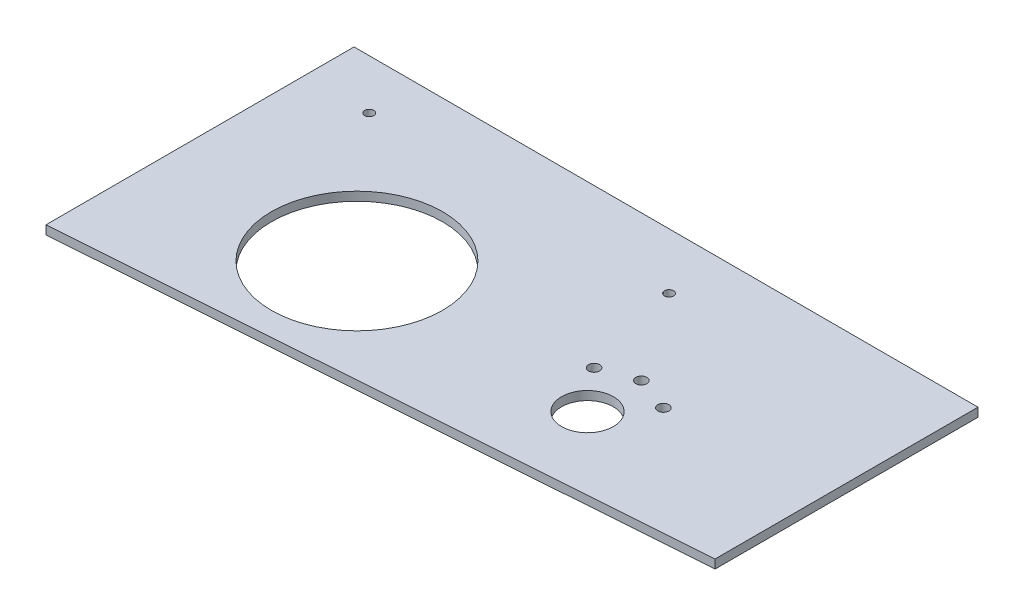
ISO-10303-21;
HEADER;
FILE_DESCRIPTION(('STEP AP214'),'2;1');
FILE_NAME('part.step','',(''),(''),'','','');
FILE_SCHEMA(('AUTOMOTIVE_DESIGN { 1 0 10303 214 1 1 1 1 }'));
ENDSEC;
DATA;
#1=APPLICATION_CONTEXT('core data for automotive mechanical design processes');
#2=APPLICATION_PROTOCOL_DEFINITION('international standard','automotive_design',2000,#1);
#3=PRODUCT_CONTEXT('',#1,'mechanical');
#4=PRODUCT('Part','Part','',(#3));
#5=PRODUCT_RELATED_PRODUCT_CATEGORY('part','',(#4));
#6=PRODUCT_DEFINITION_FORMATION('','',#4);
#7=PRODUCT_DEFINITION_CONTEXT('part definition',#1,'design');
#8=PRODUCT_DEFINITION('design','',#6,#7);
#9=PRODUCT_DEFINITION_SHAPE('','',#8);
#10=(LENGTH_UNIT() NAMED_UNIT(*) SI_UNIT(.MILLI.,.METRE.));
#11=(NAMED_UNIT(*) PLANE_ANGLE_UNIT() SI_UNIT($,.RADIAN.));
#12=(NAMED_UNIT(*) SI_UNIT($,.STERADIAN.) SOLID_ANGLE_UNIT());
#13=UNCERTAINTY_MEASURE_WITH_UNIT(LENGTH_MEASURE(1.E-05),#10,'distance_accuracy_value','');
#14=(GEOMETRIC_REPRESENTATION_CONTEXT(3) GLOBAL_UNCERTAINTY_ASSIGNED_CONTEXT((#13)) GLOBAL_UNIT_ASSIGNED_CONTEXT((#10,
#11,#12)) REPRESENTATION_CONTEXT('',''));
#15=CARTESIAN_POINT('',(0.,0.,0.));
#16=DIRECTION('',(0.,0.,1.));
#17=DIRECTION('',(1.,0.,0.));
#18=AXIS2_PLACEMENT_3D('',#15,#16,#17);
#19=CARTESIAN_POINT('',(-220.848796652154,6.35,-17.1230309984494));
#20=DIRECTION('',(0.,0.,1.));
#21=DIRECTION('',(1.,0.,0.));
#22=AXIS2_PLACEMENT_3D('',#19,#20,#21);
#23=PLANE('',#22);
#24=DIRECTION('',(-1.,0.,0.));
#25=VECTOR('',#24,1.);
#26=CARTESIAN_POINT('',(-220.848796652154,0.,-17.1230309984494));
#27=LINE('',#26,#25);
#28=CARTESIAN_POINT('',(-220.848796652154,0.,-17.1230309984494));
#29=VERTEX_POINT('',#28);
#30=CARTESIAN_POINT('',(-672.39173184106,0.,-17.1230309984494));
#31=VERTEX_POINT('',#30);
#32=EDGE_CURVE('E112',#29,#31,#27,.T.);
#33=ORIENTED_EDGE('',*,*,#32,.T.);
#34=DIRECTION('',(0.,-1.,0.));
#35=VECTOR('',#34,1.);
#36=CARTESIAN_POINT('',(-672.39173184106,6.35,-17.1230309984494));
#37=LINE('',#36,#35);
#38=CARTESIAN_POINT('',(-672.39173184106,6.35,-17.1230309984494));
#39=VERTEX_POINT('',#38);
#40=EDGE_CURVE('E12',#39,#31,#37,.T.);
#41=ORIENTED_EDGE('',*,*,#40,.F.);
#42=DIRECTION('',(-1.,0.,0.));
#43=VECTOR('',#42,1.);
#44=CARTESIAN_POINT('',(-220.848796652154,6.35,-17.1230309984494));
#45=LINE('',#44,#43);
#46=CARTESIAN_POINT('',(-220.848796652154,6.35,-17.1230309984494));
#47=VERTEX_POINT('',#46);
#48=EDGE_CURVE('E100',#47,#39,#45,.T.);
#49=ORIENTED_EDGE('',*,*,#48,.F.);
#50=DIRECTION('',(0.,-1.,0.));
#51=VECTOR('',#50,1.);
#52=CARTESIAN_POINT('',(-220.848796652154,6.35,-17.1230309984494));
#53=LINE('',#52,#51);
#54=EDGE_CURVE('E108',#47,#29,#53,.T.);
#55=ORIENTED_EDGE('',*,*,#54,.T.);
#56=EDGE_LOOP('',(#33,#41,#49,#55));
#57=FACE_BOUND('',#56,.T.);
#58=ADVANCED_FACE('F47',(#57),#23,.F.);
#59=CARTESIAN_POINT('',(-672.39173184106,6.35,-17.1230309984494));
#60=DIRECTION('',(1.,0.,0.));
#61=DIRECTION('',(0.,0.,-1.));
#62=AXIS2_PLACEMENT_3D('',#59,#60,#61);
#63=PLANE('',#62);
#64=DIRECTION('',(0.,0.,1.));
#65=VECTOR('',#64,1.);
#66=CARTESIAN_POINT('',(-672.39173184106,0.,-17.1230309984494));
#67=LINE('',#66,#65);
#68=CARTESIAN_POINT('',(-672.39173184106,0.,205.80854392186));
#69=VERTEX_POINT('',#68);
#70=EDGE_CURVE('E104',#31,#69,#67,.T.);
#71=ORIENTED_EDGE('',*,*,#70,.T.);
#72=DIRECTION('',(0.,-1.,0.));
#73=VECTOR('',#72,1.);
#74=CARTESIAN_POINT('',(-672.39173184106,6.35,205.80854392186));
#75=LINE('',#74,#73);
#76=CARTESIAN_POINT('',(-672.39173184106,6.35,205.80854392186));
#77=VERTEX_POINT('',#76);
#78=EDGE_CURVE('E55',#77,#69,#75,.T.);
#79=ORIENTED_EDGE('',*,*,#78,.F.);
#80=DIRECTION('',(0.,0.,1.));
#81=VECTOR('',#80,1.);
#82=CARTESIAN_POINT('',(-672.39173184106,6.35,-17.1230309984494));
#83=LINE('',#82,#81);
#84=EDGE_CURVE('E95',#39,#77,#83,.T.);
#85=ORIENTED_EDGE('',*,*,#84,.F.);
#86=ORIENTED_EDGE('',*,*,#40,.T.);
#87=EDGE_LOOP('',(#71,#79,#85,#86));
#88=FACE_BOUND('',#87,.T.);
#89=ADVANCED_FACE('F103',(#88),#63,.F.);
#90=CARTESIAN_POINT('',(-672.39173184106,6.35,205.80854392186));
#91=DIRECTION('',(-0.0721386043647769,0.,-0.997394616869523));
#92=DIRECTION('',(-0.997394616869523,0.,0.0721386043647769));
#93=AXIS2_PLACEMENT_3D('',#90,#91,#92);
#94=PLANE('',#93);
#95=DIRECTION('',(0.997394616869523,0.,-0.0721386043647769));
#96=VECTOR('',#95,1.);
#97=CARTESIAN_POINT('',(-672.39173184106,0.,205.80854392186));
#98=LINE('',#97,#96);
#99=CARTESIAN_POINT('',(-220.848796652154,0.,173.149778169203));
#100=VERTEX_POINT('',#99);
#101=EDGE_CURVE('E82',#69,#100,#98,.T.);
#102=ORIENTED_EDGE('',*,*,#101,.T.);
#103=DIRECTION('',(0.,-1.,0.));
#104=VECTOR('',#103,1.);
#105=CARTESIAN_POINT('',(-220.848796652154,6.35,173.149778169203));
#106=LINE('',#105,#104);
#107=CARTESIAN_POINT('',(-220.848796652154,6.35,173.149778169203));
#108=VERTEX_POINT('',#107);
#109=EDGE_CURVE('E105',#108,#100,#106,.T.);
#110=ORIENTED_EDGE('',*,*,#109,.F.);
#111=DIRECTION('',(0.997394616869523,0.,-0.0721386043647769));
#112=VECTOR('',#111,1.);
#113=CARTESIAN_POINT('',(-672.39173184106,6.35,205.80854392186));
#114=LINE('',#113,#112);
#115=EDGE_CURVE('E98',#77,#108,#114,.T.);
#116=ORIENTED_EDGE('',*,*,#115,.F.);
#117=ORIENTED_EDGE('',*,*,#78,.T.);
#118=EDGE_LOOP('',(#102,#110,#116,#117));
#119=FACE_BOUND('',#118,.T.);
#120=ADVANCED_FACE('F106',(#119),#94,.F.);
#121=CARTESIAN_POINT('',(-220.848796652154,6.35,173.149778169203));
#122=DIRECTION('',(-1.,0.,0.));
#123=DIRECTION('',(0.,0.,1.));
#124=AXIS2_PLACEMENT_3D('',#121,#122,#123);
#125=PLANE('',#124);
#126=DIRECTION('',(0.,0.,-1.));
#127=VECTOR('',#126,1.);
#128=CARTESIAN_POINT('',(-220.848796652154,0.,173.149778169203));
#129=LINE('',#128,#127);
#130=EDGE_CURVE('E88',#100,#29,#129,.T.);
#131=ORIENTED_EDGE('',*,*,#130,.T.);
#132=ORIENTED_EDGE('',*,*,#54,.F.);
#133=DIRECTION('',(0.,0.,-1.));
#134=VECTOR('',#133,1.);
#135=CARTESIAN_POINT('',(-220.848796652154,6.35,173.149778169203));
#136=LINE('',#135,#134);
#137=EDGE_CURVE('E63',#108,#47,#136,.T.);
#138=ORIENTED_EDGE('',*,*,#137,.F.);
#139=ORIENTED_EDGE('',*,*,#109,.T.);
#140=EDGE_LOOP('',(#131,#132,#138,#139));
#141=FACE_BOUND('',#140,.T.);
#142=ADVANCED_FACE('F121',(#141),#125,.F.);
#143=CARTESIAN_POINT('',(0.,6.35,0.));
#144=DIRECTION('',(0.,1.,0.));
#145=DIRECTION('',(0.,0.,1.));
#146=AXIS2_PLACEMENT_3D('',#143,#144,#145);
#147=PLANE('',#146);
#148=CARTESIAN_POINT('',(-359.363535158428,6.35,87.9976546238515));
#149=DIRECTION('',(0.,1.,0.));
#150=DIRECTION('',(0.,0.,1.));
#151=AXIS2_PLACEMENT_3D('',#148,#149,#150);
#152=CIRCLE('',#151,3.99999999999994);
#153=CARTESIAN_POINT('',(-359.363535158428,6.35,91.9976546238514));
#154=VERTEX_POINT('',#153);
#155=EDGE_CURVE('E145',#154,#154,#152,.T.);
#156=ORIENTED_EDGE('',*,*,#155,.F.);
#157=EDGE_LOOP('',(#156));
#158=FACE_BOUND('',#157,.T.);
#159=CARTESIAN_POINT('',(-625.491718044603,6.35,18.7958333678113));
#160=DIRECTION('',(0.,1.,0.));
#161=DIRECTION('',(0.,0.,1.));
#162=AXIS2_PLACEMENT_3D('',#159,#160,#161);
#163=CIRCLE('',#162,3.29999999999997);
#164=CARTESIAN_POINT('',(-625.491718044603,6.35,22.0958333678113));
#165=VERTEX_POINT('',#164);
#166=EDGE_CURVE('E152',#165,#165,#163,.T.);
#167=ORIENTED_EDGE('',*,*,#166,.F.);
#168=EDGE_LOOP('',(#167));
#169=FACE_BOUND('',#168,.T.);
#170=CARTESIAN_POINT('',(-403.939830291678,6.35,23.3318519883842));
#171=DIRECTION('',(0.,1.,0.));
#172=DIRECTION('',(0.,0.,1.));
#173=AXIS2_PLACEMENT_3D('',#170,#171,#172);
#174=CIRCLE('',#173,3.30000000000003);
#175=CARTESIAN_POINT('',(-403.939830291678,6.35,26.6318519883842));
#176=VERTEX_POINT('',#175);
#177=EDGE_CURVE('E133',#176,#176,#174,.T.);
#178=ORIENTED_EDGE('',*,*,#177,.F.);
#179=EDGE_LOOP('',(#178));
#180=FACE_BOUND('',#179,.T.);
#181=CARTESIAN_POINT('',(-359.363535158427,6.35,126.997654623851));
#182=DIRECTION('',(0.,1.,0.));
#183=DIRECTION('',(0.,0.,1.));
#184=AXIS2_PLACEMENT_3D('',#181,#182,#183);
#185=CIRCLE('',#184,18.7499999999999);
#186=CARTESIAN_POINT('',(-359.363535158427,6.35,145.747654623851));
#187=VERTEX_POINT('',#186);
#188=EDGE_CURVE('E140',#187,#187,#185,.T.);
#189=ORIENTED_EDGE('',*,*,#188,.F.);
#190=EDGE_LOOP('',(#189));
#191=FACE_BOUND('',#190,.T.);
#192=CARTESIAN_POINT('',(-384.432251936203,6.35,97.1219213422115));
#193=DIRECTION('',(0.,1.,0.));
#194=DIRECTION('',(0.,0.,1.));
#195=AXIS2_PLACEMENT_3D('',#192,#193,#194);
#196=CIRCLE('',#195,4.00000000000005);
#197=CARTESIAN_POINT('',(-384.432251936203,6.35,101.121921342212));
#198=VERTEX_POINT('',#197);
#199=EDGE_CURVE('E163',#198,#198,#196,.T.);
#200=ORIENTED_EDGE('',*,*,#199,.F.);
#201=EDGE_LOOP('',(#200));
#202=FACE_BOUND('',#201,.T.);
#203=CARTESIAN_POINT('',(-334.294818380653,6.35,97.121921342211));
#204=DIRECTION('',(0.,1.,0.));
#205=DIRECTION('',(0.,0.,1.));
#206=AXIS2_PLACEMENT_3D('',#203,#204,#205);
#207=CIRCLE('',#206,4.00000000000023);
#208=CARTESIAN_POINT('',(-334.294818380653,6.35,101.121921342211));
#209=VERTEX_POINT('',#208);
#210=EDGE_CURVE('E157',#209,#209,#207,.T.);
#211=ORIENTED_EDGE('',*,*,#210,.F.);
#212=EDGE_LOOP('',(#211));
#213=FACE_BOUND('',#212,.T.);
#214=CARTESIAN_POINT('',(-537.163535159258,6.35,115.999131995791));
#215=DIRECTION('',(0.,1.,0.));
#216=DIRECTION('',(0.,0.,1.));
#217=AXIS2_PLACEMENT_3D('',#214,#215,#216);
#218=CIRCLE('',#217,61.9124999999801);
#219=CARTESIAN_POINT('',(-537.163535159258,6.35,177.911631995771));
#220=VERTEX_POINT('',#219);
#221=EDGE_CURVE('E127',#220,#220,#218,.T.);
#222=ORIENTED_EDGE('',*,*,#221,.F.);
#223=EDGE_LOOP('',(#222));
#224=FACE_BOUND('',#223,.T.);
#225=ORIENTED_EDGE('',*,*,#48,.T.);
#226=ORIENTED_EDGE('',*,*,#84,.T.);
#227=ORIENTED_EDGE('',*,*,#115,.T.);
#228=ORIENTED_EDGE('',*,*,#137,.T.);
#229=EDGE_LOOP('',(#225,#226,#227,#228));
#230=FACE_BOUND('',#229,.T.);
#231=ADVANCED_FACE('F96',(#158,#169,#180,#191,#202,#213,#224,#230),#147,.T.);
#232=CARTESIAN_POINT('',(0.,0.,0.));
#233=DIRECTION('',(0.,1.,0.));
#234=DIRECTION('',(0.,0.,1.));
#235=AXIS2_PLACEMENT_3D('',#232,#233,#234);
#236=PLANE('',#235);
#237=CARTESIAN_POINT('',(-359.363535158428,0.,87.9976546238515));
#238=DIRECTION('',(0.,1.,0.));
#239=DIRECTION('',(0.,0.,1.));
#240=AXIS2_PLACEMENT_3D('',#237,#238,#239);
#241=CIRCLE('',#240,3.99999999999994);
#242=CARTESIAN_POINT('',(-359.363535158428,0.,91.9976546238514));
#243=VERTEX_POINT('',#242);
#244=EDGE_CURVE('E148',#243,#243,#241,.T.);
#245=ORIENTED_EDGE('',*,*,#244,.T.);
#246=EDGE_LOOP('',(#245));
#247=FACE_BOUND('',#246,.T.);
#248=CARTESIAN_POINT('',(-625.491718044603,0.,18.7958333678113));
#249=DIRECTION('',(0.,1.,0.));
#250=DIRECTION('',(0.,0.,1.));
#251=AXIS2_PLACEMENT_3D('',#248,#249,#250);
#252=CIRCLE('',#251,3.29999999999997);
#253=CARTESIAN_POINT('',(-625.491718044603,0.,22.0958333678113));
#254=VERTEX_POINT('',#253);
#255=EDGE_CURVE('E137',#254,#254,#252,.T.);
#256=ORIENTED_EDGE('',*,*,#255,.T.);
#257=EDGE_LOOP('',(#256));
#258=FACE_BOUND('',#257,.T.);
#259=CARTESIAN_POINT('',(-403.939830291678,0.,23.3318519883842));
#260=DIRECTION('',(0.,1.,0.));
#261=DIRECTION('',(0.,0.,1.));
#262=AXIS2_PLACEMENT_3D('',#259,#260,#261);
#263=CIRCLE('',#262,3.30000000000003);
#264=CARTESIAN_POINT('',(-403.939830291678,0.,26.6318519883842));
#265=VERTEX_POINT('',#264);
#266=EDGE_CURVE('E136',#265,#265,#263,.T.);
#267=ORIENTED_EDGE('',*,*,#266,.T.);
#268=EDGE_LOOP('',(#267));
#269=FACE_BOUND('',#268,.T.);
#270=CARTESIAN_POINT('',(-359.363535158427,0.,126.997654623851));
#271=DIRECTION('',(0.,1.,0.));
#272=DIRECTION('',(0.,0.,1.));
#273=AXIS2_PLACEMENT_3D('',#270,#271,#272);
#274=CIRCLE('',#273,18.7499999999999);
#275=CARTESIAN_POINT('',(-359.363535158427,0.,145.747654623851));
#276=VERTEX_POINT('',#275);
#277=EDGE_CURVE('E130',#276,#276,#274,.T.);
#278=ORIENTED_EDGE('',*,*,#277,.T.);
#279=EDGE_LOOP('',(#278));
#280=FACE_BOUND('',#279,.T.);
#281=CARTESIAN_POINT('',(-384.432251936203,0.,97.1219213422115));
#282=DIRECTION('',(0.,1.,0.));
#283=DIRECTION('',(0.,0.,1.));
#284=AXIS2_PLACEMENT_3D('',#281,#282,#283);
#285=CIRCLE('',#284,4.00000000000005);
#286=CARTESIAN_POINT('',(-384.432251936203,0.,101.121921342212));
#287=VERTEX_POINT('',#286);
#288=EDGE_CURVE('E149',#287,#287,#285,.T.);
#289=ORIENTED_EDGE('',*,*,#288,.T.);
#290=EDGE_LOOP('',(#289));
#291=FACE_BOUND('',#290,.T.);
#292=CARTESIAN_POINT('',(-334.294818380653,0.,97.121921342211));
#293=DIRECTION('',(0.,1.,0.));
#294=DIRECTION('',(0.,0.,1.));
#295=AXIS2_PLACEMENT_3D('',#292,#293,#294);
#296=CIRCLE('',#295,4.00000000000023);
#297=CARTESIAN_POINT('',(-334.294818380653,0.,101.121921342211));
#298=VERTEX_POINT('',#297);
#299=EDGE_CURVE('E160',#298,#298,#296,.T.);
#300=ORIENTED_EDGE('',*,*,#299,.T.);
#301=EDGE_LOOP('',(#300));
#302=FACE_BOUND('',#301,.T.);
#303=CARTESIAN_POINT('',(-537.163535159258,0.,115.999131995791));
#304=DIRECTION('',(0.,1.,0.));
#305=DIRECTION('',(0.,0.,1.));
#306=AXIS2_PLACEMENT_3D('',#303,#304,#305);
#307=CIRCLE('',#306,61.9124999999801);
#308=CARTESIAN_POINT('',(-537.163535159258,0.,177.911631995771));
#309=VERTEX_POINT('',#308);
#310=EDGE_CURVE('E115',#309,#309,#307,.T.);
#311=ORIENTED_EDGE('',*,*,#310,.T.);
#312=EDGE_LOOP('',(#311));
#313=FACE_BOUND('',#312,.T.);
#314=ORIENTED_EDGE('',*,*,#32,.F.);
#315=ORIENTED_EDGE('',*,*,#130,.F.);
#316=ORIENTED_EDGE('',*,*,#101,.F.);
#317=ORIENTED_EDGE('',*,*,#70,.F.);
#318=EDGE_LOOP('',(#314,#315,#316,#317));
#319=FACE_BOUND('',#318,.T.);
#320=ADVANCED_FACE('F124',(#247,#258,#269,#280,#291,#302,#313,#319),#236,.F.);
#321=CARTESIAN_POINT('',(-537.163535159258,0.,115.999131995791));
#322=DIRECTION('',(0.,1.,0.));
#323=DIRECTION('',(0.,0.,1.));
#324=AXIS2_PLACEMENT_3D('',#321,#322,#323);
#325=CYLINDRICAL_SURFACE('',#324,61.9124999999801);
#326=ORIENTED_EDGE('',*,*,#310,.F.);
#327=EDGE_LOOP('',(#326));
#328=FACE_BOUND('',#327,.T.);
#329=ORIENTED_EDGE('',*,*,#221,.T.);
#330=EDGE_LOOP('',(#329));
#331=FACE_BOUND('',#330,.T.);
#332=ADVANCED_FACE('F187',(#328,#331),#325,.F.);
#333=CARTESIAN_POINT('',(-334.294818380653,0.,97.121921342211));
#334=DIRECTION('',(0.,1.,0.));
#335=DIRECTION('',(0.,0.,1.));
#336=AXIS2_PLACEMENT_3D('',#333,#334,#335);
#337=CYLINDRICAL_SURFACE('',#336,4.00000000000023);
#338=ORIENTED_EDGE('',*,*,#299,.F.);
#339=EDGE_LOOP('',(#338));
#340=FACE_BOUND('',#339,.T.);
#341=ORIENTED_EDGE('',*,*,#210,.T.);
#342=EDGE_LOOP('',(#341));
#343=FACE_BOUND('',#342,.T.);
#344=ADVANCED_FACE('F175',(#340,#343),#337,.F.);
#345=CARTESIAN_POINT('',(-384.432251936203,0.,97.1219213422115));
#346=DIRECTION('',(0.,1.,0.));
#347=DIRECTION('',(0.,0.,1.));
#348=AXIS2_PLACEMENT_3D('',#345,#346,#347);
#349=CYLINDRICAL_SURFACE('',#348,4.00000000000005);
#350=ORIENTED_EDGE('',*,*,#288,.F.);
#351=EDGE_LOOP('',(#350));
#352=FACE_BOUND('',#351,.T.);
#353=ORIENTED_EDGE('',*,*,#199,.T.);
#354=EDGE_LOOP('',(#353));
#355=FACE_BOUND('',#354,.T.);
#356=ADVANCED_FACE('F171',(#352,#355),#349,.F.);
#357=CARTESIAN_POINT('',(-359.363535158427,0.,126.997654623851));
#358=DIRECTION('',(0.,1.,0.));
#359=DIRECTION('',(0.,0.,1.));
#360=AXIS2_PLACEMENT_3D('',#357,#358,#359);
#361=CYLINDRICAL_SURFACE('',#360,18.7499999999999);
#362=ORIENTED_EDGE('',*,*,#277,.F.);
#363=EDGE_LOOP('',(#362));
#364=FACE_BOUND('',#363,.T.);
#365=ORIENTED_EDGE('',*,*,#188,.T.);
#366=EDGE_LOOP('',(#365));
#367=FACE_BOUND('',#366,.T.);
#368=ADVANCED_FACE('F174',(#364,#367),#361,.F.);
#369=CARTESIAN_POINT('',(-403.939830291678,0.,23.3318519883842));
#370=DIRECTION('',(0.,1.,0.));
#371=DIRECTION('',(0.,0.,1.));
#372=AXIS2_PLACEMENT_3D('',#369,#370,#371);
#373=CYLINDRICAL_SURFACE('',#372,3.30000000000003);
#374=ORIENTED_EDGE('',*,*,#266,.F.);
#375=EDGE_LOOP('',(#374));
#376=FACE_BOUND('',#375,.T.);
#377=ORIENTED_EDGE('',*,*,#177,.T.);
#378=EDGE_LOOP('',(#377));
#379=FACE_BOUND('',#378,.T.);
#380=ADVANCED_FACE('F250',(#376,#379),#373,.F.);
#381=CARTESIAN_POINT('',(-625.491718044603,0.,18.7958333678113));
#382=DIRECTION('',(0.,1.,0.));
#383=DIRECTION('',(0.,0.,1.));
#384=AXIS2_PLACEMENT_3D('',#381,#382,#383);
#385=CYLINDRICAL_SURFACE('',#384,3.29999999999997);
#386=ORIENTED_EDGE('',*,*,#255,.F.);
#387=EDGE_LOOP('',(#386));
#388=FACE_BOUND('',#387,.T.);
#389=ORIENTED_EDGE('',*,*,#166,.T.);
#390=EDGE_LOOP('',(#389));
#391=FACE_BOUND('',#390,.T.);
#392=ADVANCED_FACE('F260',(#388,#391),#385,.F.);
#393=CARTESIAN_POINT('',(-359.363535158428,0.,87.9976546238515));
#394=DIRECTION('',(0.,1.,0.));
#395=DIRECTION('',(0.,0.,1.));
#396=AXIS2_PLACEMENT_3D('',#393,#394,#395);
#397=CYLINDRICAL_SURFACE('',#396,3.99999999999994);
#398=ORIENTED_EDGE('',*,*,#244,.F.);
#399=EDGE_LOOP('',(#398));
#400=FACE_BOUND('',#399,.T.);
#401=ORIENTED_EDGE('',*,*,#155,.T.);
#402=EDGE_LOOP('',(#401));
#403=FACE_BOUND('',#402,.T.);
#404=ADVANCED_FACE('F269',(#400,#403),#397,.F.);
#405=CLOSED_SHELL('',(#58,#89,#120,#142,#231,#320,#332,#344,#356,#368,#380,#392,#404));
#406=MANIFOLD_SOLID_BREP('B2',#405);
#407=ADVANCED_BREP_SHAPE_REPRESENTATION('',(#18,#406),#14);
#408=SHAPE_DEFINITION_REPRESENTATION(#9,#407);
ENDSEC;
END-ISO-10303-21;
